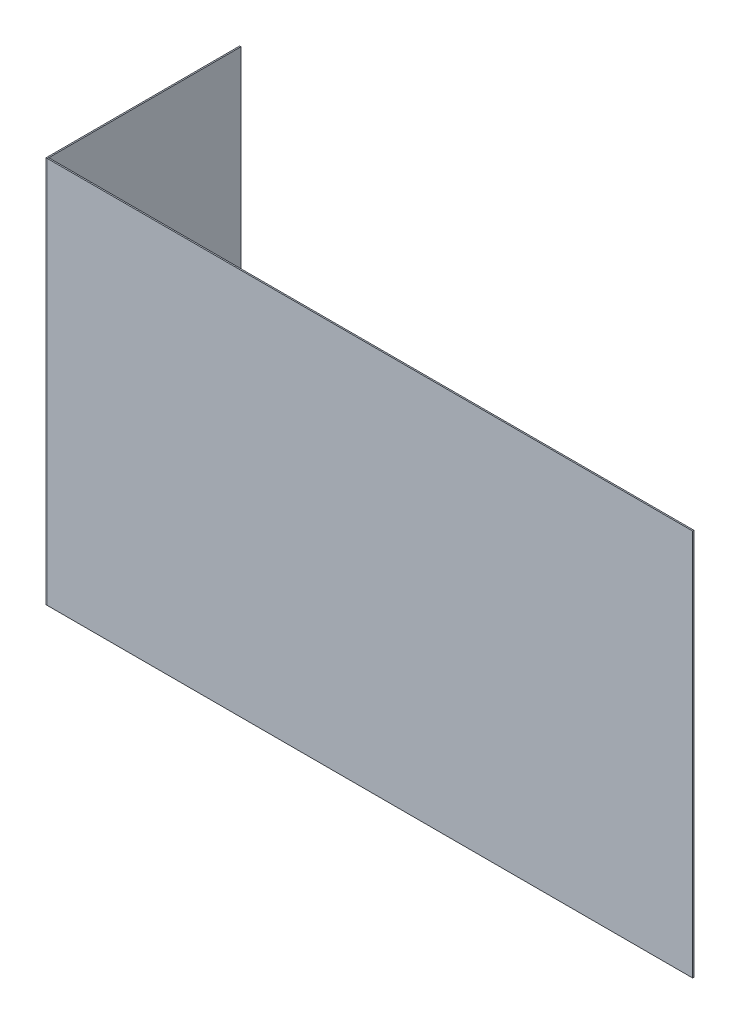
ISO-10303-21;
HEADER;
FILE_DESCRIPTION(('STEP AP214'),'2;1');
FILE_NAME('part.step','',(''),(''),'','','');
FILE_SCHEMA(('AUTOMOTIVE_DESIGN { 1 0 10303 214 1 1 1 1 }'));
ENDSEC;
DATA;
#1=APPLICATION_CONTEXT('core data for automotive mechanical design processes');
#2=APPLICATION_PROTOCOL_DEFINITION('international standard','automotive_design',2000,#1);
#3=PRODUCT_CONTEXT('',#1,'mechanical');
#4=PRODUCT('Part','Part','',(#3));
#5=PRODUCT_RELATED_PRODUCT_CATEGORY('part','',(#4));
#6=PRODUCT_DEFINITION_FORMATION('','',#4);
#7=PRODUCT_DEFINITION_CONTEXT('part definition',#1,'design');
#8=PRODUCT_DEFINITION('design','',#6,#7);
#9=PRODUCT_DEFINITION_SHAPE('','',#8);
#10=(LENGTH_UNIT() NAMED_UNIT(*) SI_UNIT(.MILLI.,.METRE.));
#11=(NAMED_UNIT(*) PLANE_ANGLE_UNIT() SI_UNIT($,.RADIAN.));
#12=(NAMED_UNIT(*) SI_UNIT($,.STERADIAN.) SOLID_ANGLE_UNIT());
#13=UNCERTAINTY_MEASURE_WITH_UNIT(LENGTH_MEASURE(1.E-05),#10,'distance_accuracy_value','');
#14=(GEOMETRIC_REPRESENTATION_CONTEXT(3) GLOBAL_UNCERTAINTY_ASSIGNED_CONTEXT((#13)) GLOBAL_UNIT_ASSIGNED_CONTEXT((#10,
#11,#12)) REPRESENTATION_CONTEXT('',''));
#15=CARTESIAN_POINT('',(0.,0.,0.));
#16=DIRECTION('',(0.,0.,1.));
#17=DIRECTION('',(1.,0.,0.));
#18=AXIS2_PLACEMENT_3D('',#15,#16,#17);
#19=CARTESIAN_POINT('',(-68.7543594667373,-13.6887447732236,2.85715075929774));
#20=DIRECTION('',(-0.999999998763547,2.53763678809025E-06,4.96635296327839E-05));
#21=DIRECTION('',(2.53763679121975E-06,0.99999999999678,0.));
#22=AXIS2_PLACEMENT_3D('',#19,#20,#21);
#23=PLANE('',#22);
#24=DIRECTION('',(-2.53763678787463E-06,-0.99999999999678,6.73555915897836E-11));
#25=VECTOR('',#24,1.);
#26=CARTESIAN_POINT('',(-68.7543594667373,-13.6887447732236,2.85715075929774));
#27=LINE('',#26,#25);
#28=CARTESIAN_POINT('',(-68.7543594667373,-13.6887447732236,2.85715075929774));
#29=VERTEX_POINT('',#28);
#30=CARTESIAN_POINT('',(-68.7543602280284,-13.9887447732226,2.85715075931795));
#31=VERTEX_POINT('',#30);
#32=EDGE_CURVE('E209',#29,#31,#27,.T.);
#33=ORIENTED_EDGE('',*,*,#32,.T.);
#34=DIRECTION('',(-4.96635296327949E-05,5.86724083053525E-11,-0.999999998766767));
#35=VECTOR('',#34,1.);
#36=CARTESIAN_POINT('',(-68.7543602280284,-13.9887447732226,2.85715075931795));
#37=LINE('',#36,#35);
#38=CARTESIAN_POINT('',(-68.7543602776919,-13.9887447732226,2.85615075931918));
#39=VERTEX_POINT('',#38);
#40=EDGE_CURVE('E21',#31,#39,#37,.T.);
#41=ORIENTED_EDGE('',*,*,#40,.T.);
#42=DIRECTION('',(-2.53763678787463E-06,-0.99999999999678,6.73555915897836E-11));
#43=VECTOR('',#42,1.);
#44=CARTESIAN_POINT('',(-68.7543595164009,-13.6887447732236,2.85615075929898));
#45=LINE('',#44,#43);
#46=CARTESIAN_POINT('',(-68.7543595164009,-13.6887447732236,2.85615075929898));
#47=VERTEX_POINT('',#46);
#48=EDGE_CURVE('E195',#47,#39,#45,.T.);
#49=ORIENTED_EDGE('',*,*,#48,.F.);
#50=DIRECTION('',(-4.96635296327949E-05,5.86724083053525E-11,-0.999999998766767));
#51=VECTOR('',#50,1.);
#52=CARTESIAN_POINT('',(-68.7543594667373,-13.6887447732236,2.85715075929774));
#53=LINE('',#52,#51);
#54=EDGE_CURVE('E11',#29,#47,#53,.T.);
#55=ORIENTED_EDGE('',*,*,#54,.F.);
#56=EDGE_LOOP('',(#33,#41,#49,#55));
#57=FACE_BOUND('',#56,.T.);
#58=ADVANCED_FACE('F17',(#57),#23,.F.);
#59=CARTESIAN_POINT('',(-69.2553594661179,-13.6887435018676,2.85717564072609));
#60=DIRECTION('',(-2.53763678787463E-06,-0.99999999999678,6.73555915897836E-11));
#61=DIRECTION('',(-0.99999999999678,2.53763678787463E-06,0.));
#62=AXIS2_PLACEMENT_3D('',#59,#60,#61);
#63=PLANE('',#62);
#64=ORIENTED_EDGE('',*,*,#54,.T.);
#65=DIRECTION('',(0.999999998763547,-2.53763678809025E-06,-4.96635296327839E-05));
#66=VECTOR('',#65,1.);
#67=CARTESIAN_POINT('',(-69.2553595157814,-13.6887435018675,2.85617564072732));
#68=LINE('',#67,#66);
#69=CARTESIAN_POINT('',(-69.2543595157826,-13.6887435044052,2.85617559106379));
#70=VERTEX_POINT('',#69);
#71=EDGE_CURVE('E74',#70,#47,#68,.T.);
#72=ORIENTED_EDGE('',*,*,#71,.F.);
#73=DIRECTION('',(-4.9663529633017E-05,5.86724083059159E-11,-0.999999998766767));
#74=VECTOR('',#73,1.);
#75=CARTESIAN_POINT('',(-69.2543594661191,-13.6887435044052,2.85717559106256));
#76=LINE('',#75,#74);
#77=CARTESIAN_POINT('',(-69.2543594661191,-13.6887435044052,2.85717559106256));
#78=VERTEX_POINT('',#77);
#79=EDGE_CURVE('E192',#78,#70,#76,.T.);
#80=ORIENTED_EDGE('',*,*,#79,.F.);
#81=DIRECTION('',(0.999999998763547,-2.53763678809025E-06,-4.96635296327839E-05));
#82=VECTOR('',#81,1.);
#83=CARTESIAN_POINT('',(-69.2553594661179,-13.6887435018676,2.85717564072609));
#84=LINE('',#83,#82);
#85=EDGE_CURVE('E204',#78,#29,#84,.T.);
#86=ORIENTED_EDGE('',*,*,#85,.T.);
#87=EDGE_LOOP('',(#64,#72,#80,#86));
#88=FACE_BOUND('',#87,.T.);
#89=ADVANCED_FACE('F19',(#88),#63,.F.);
#90=CARTESIAN_POINT('',(-68.7543602280284,-13.9887447732226,2.85715075931795));
#91=DIRECTION('',(2.53763678787463E-06,0.99999999999678,-6.73555915897837E-11));
#92=DIRECTION('',(-2.65426446715687E-05,0.,-0.999999999647744));
#93=AXIS2_PLACEMENT_3D('',#90,#91,#92);
#94=PLANE('',#93);
#95=DIRECTION('',(4.9663529633017E-05,-5.86724083059159E-11,0.999999998766767));
#96=VECTOR('',#95,1.);
#97=CARTESIAN_POINT('',(-69.2543676769396,-13.9887435043955,2.70717559126775));
#98=LINE('',#97,#96);
#99=CARTESIAN_POINT('',(-69.2543602770737,-13.9887435044042,2.856175591084));
#100=VERTEX_POINT('',#99);
#101=CARTESIAN_POINT('',(-69.2543602274101,-13.9887435044043,2.85717559108277));
#102=VERTEX_POINT('',#101);
#103=EDGE_CURVE('E189',#100,#102,#98,.T.);
#104=ORIENTED_EDGE('',*,*,#103,.F.);
#105=DIRECTION('',(-0.999999998763547,2.53763678809025E-06,4.96635296327839E-05));
#106=VECTOR('',#105,1.);
#107=CARTESIAN_POINT('',(-68.7543602776919,-13.9887447732226,2.85615075931918));
#108=LINE('',#107,#106);
#109=EDGE_CURVE('E198',#39,#100,#108,.T.);
#110=ORIENTED_EDGE('',*,*,#109,.F.);
#111=ORIENTED_EDGE('',*,*,#40,.F.);
#112=DIRECTION('',(-0.999999998763547,2.53763678809025E-06,4.96635296327839E-05));
#113=VECTOR('',#112,1.);
#114=CARTESIAN_POINT('',(-68.7543602280284,-13.9887447732226,2.85715075931795));
#115=LINE('',#114,#113);
#116=EDGE_CURVE('E84',#31,#102,#115,.T.);
#117=ORIENTED_EDGE('',*,*,#116,.T.);
#118=EDGE_LOOP('',(#104,#110,#111,#117));
#119=FACE_BOUND('',#118,.T.);
#120=ADVANCED_FACE('F216',(#119),#94,.F.);
#121=CARTESIAN_POINT('',(-69.2553594661179,-13.6887435018676,2.85717564072609));
#122=DIRECTION('',(4.96635296327949E-05,-5.86724083053525E-11,0.999999998766767));
#123=DIRECTION('',(-1.18139827634337E-06,-0.999999999999302,0.));
#124=AXIS2_PLACEMENT_3D('',#121,#122,#123);
#125=PLANE('',#124);
#126=ORIENTED_EDGE('',*,*,#85,.F.);
#127=DIRECTION('',(2.53763678787463E-06,0.99999999999678,-6.73555915897836E-11));
#128=VECTOR('',#127,1.);
#129=CARTESIAN_POINT('',(-69.2543602274101,-13.9887435044043,2.85717559108277));
#130=LINE('',#129,#128);
#131=EDGE_CURVE('E173',#102,#78,#130,.T.);
#132=ORIENTED_EDGE('',*,*,#131,.F.);
#133=ORIENTED_EDGE('',*,*,#116,.F.);
#134=ORIENTED_EDGE('',*,*,#32,.F.);
#135=EDGE_LOOP('',(#126,#132,#133,#134));
#136=FACE_BOUND('',#135,.T.);
#137=ADVANCED_FACE('F236',(#136),#125,.T.);
#138=CARTESIAN_POINT('',(-69.2553595157814,-13.6887435018675,2.85617564072732));
#139=DIRECTION('',(4.96635296327949E-05,-5.86724083053525E-11,0.999999998766767));
#140=DIRECTION('',(-1.18139827634337E-06,-0.999999999999302,0.));
#141=AXIS2_PLACEMENT_3D('',#138,#139,#140);
#142=PLANE('',#141);
#143=ORIENTED_EDGE('',*,*,#48,.T.);
#144=ORIENTED_EDGE('',*,*,#109,.T.);
#145=DIRECTION('',(2.53763678787463E-06,0.99999999999678,-6.73555915897836E-11));
#146=VECTOR('',#145,1.);
#147=CARTESIAN_POINT('',(-69.2543595157826,-13.6887435044052,2.85617559106379));
#148=LINE('',#147,#146);
#149=EDGE_CURVE('E127',#100,#70,#148,.T.);
#150=ORIENTED_EDGE('',*,*,#149,.T.);
#151=ORIENTED_EDGE('',*,*,#71,.T.);
#152=EDGE_LOOP('',(#143,#144,#150,#151));
#153=FACE_BOUND('',#152,.T.);
#154=ADVANCED_FACE('F218',(#153),#142,.F.);
#155=CARTESIAN_POINT('',(-69.2543594661191,-13.6887435044052,2.85717559106256));
#156=DIRECTION('',(-2.53763678787463E-06,-0.99999999999678,6.73555915897836E-11));
#157=DIRECTION('',(-0.99999999999678,2.53763678787463E-06,0.));
#158=AXIS2_PLACEMENT_3D('',#155,#156,#157);
#159=PLANE('',#158);
#160=DIRECTION('',(0.999999998763547,-2.53763678809025E-06,-4.96635296327839E-05));
#161=VECTOR('',#160,1.);
#162=CARTESIAN_POINT('',(-69.2553595157814,-13.6887435018675,2.85617564072732));
#163=LINE('',#162,#161);
#164=CARTESIAN_POINT('',(-69.2553595157814,-13.6887435018675,2.85617564072732));
#165=VERTEX_POINT('',#164);
#166=EDGE_CURVE('E172',#165,#70,#163,.T.);
#167=ORIENTED_EDGE('',*,*,#166,.F.);
#168=DIRECTION('',(-4.96635296327949E-05,5.86724083053525E-11,-0.999999998766767));
#169=VECTOR('',#168,1.);
#170=CARTESIAN_POINT('',(-69.2553594661179,-13.6887435018676,2.85717564072609));
#171=LINE('',#170,#169);
#172=CARTESIAN_POINT('',(-69.2553594661179,-13.6887435018676,2.85717564072609));
#173=VERTEX_POINT('',#172);
#174=EDGE_CURVE('E160',#173,#165,#171,.T.);
#175=ORIENTED_EDGE('',*,*,#174,.F.);
#176=DIRECTION('',(-0.999999998763547,2.53763678809025E-06,4.96635296327839E-05));
#177=VECTOR('',#176,1.);
#178=CARTESIAN_POINT('',(-69.2543594661191,-13.6887435044052,2.85717559106256));
#179=LINE('',#178,#177);
#180=EDGE_CURVE('E177',#78,#173,#179,.T.);
#181=ORIENTED_EDGE('',*,*,#180,.F.);
#182=ORIENTED_EDGE('',*,*,#79,.T.);
#183=EDGE_LOOP('',(#167,#175,#181,#182));
#184=FACE_BOUND('',#183,.T.);
#185=ADVANCED_FACE('F224',(#184),#159,.F.);
#186=CARTESIAN_POINT('',(-69.2543676769396,-13.9887435043955,2.70717559126775));
#187=DIRECTION('',(2.53763678787463E-06,0.99999999999678,-6.73555915897837E-11));
#188=DIRECTION('',(-2.65426446715687E-05,0.,-0.999999999647744));
#189=AXIS2_PLACEMENT_3D('',#186,#187,#188);
#190=PLANE('',#189);
#191=DIRECTION('',(-0.999999998763547,2.53763678809025E-06,4.96635296327839E-05));
#192=VECTOR('',#191,1.);
#193=CARTESIAN_POINT('',(-69.2543602274101,-13.9887435044043,2.85717559108277));
#194=LINE('',#193,#192);
#195=CARTESIAN_POINT('',(-69.2553602274089,-13.9887435018666,2.8571756407463));
#196=VERTEX_POINT('',#195);
#197=EDGE_CURVE('E186',#102,#196,#194,.T.);
#198=ORIENTED_EDGE('',*,*,#197,.T.);
#199=DIRECTION('',(-4.96635296327949E-05,5.86724083053525E-11,-0.999999998766767));
#200=VECTOR('',#199,1.);
#201=CARTESIAN_POINT('',(-69.2553602274089,-13.9887435018666,2.8571756407463));
#202=LINE('',#201,#200);
#203=CARTESIAN_POINT('',(-69.2553602770724,-13.9887435018666,2.85617564074753));
#204=VERTEX_POINT('',#203);
#205=EDGE_CURVE('E164',#196,#204,#202,.T.);
#206=ORIENTED_EDGE('',*,*,#205,.T.);
#207=DIRECTION('',(-0.999999998763547,2.53763678809025E-06,4.96635296327839E-05));
#208=VECTOR('',#207,1.);
#209=CARTESIAN_POINT('',(-68.7543602776919,-13.9887447732226,2.85615075931918));
#210=LINE('',#209,#208);
#211=EDGE_CURVE('E133',#100,#204,#210,.T.);
#212=ORIENTED_EDGE('',*,*,#211,.F.);
#213=ORIENTED_EDGE('',*,*,#103,.T.);
#214=EDGE_LOOP('',(#198,#206,#212,#213));
#215=FACE_BOUND('',#214,.T.);
#216=ADVANCED_FACE('F252',(#215),#190,.F.);
#217=CARTESIAN_POINT('',(-69.2553594661179,-13.6887435018676,2.85717564072609));
#218=DIRECTION('',(4.96635296327949E-05,-5.86724083053525E-11,0.999999998766767));
#219=DIRECTION('',(-1.18139827634337E-06,-0.999999999999302,0.));
#220=AXIS2_PLACEMENT_3D('',#217,#218,#219);
#221=PLANE('',#220);
#222=ORIENTED_EDGE('',*,*,#131,.T.);
#223=ORIENTED_EDGE('',*,*,#180,.T.);
#224=DIRECTION('',(2.53763678787463E-06,0.99999999999678,-6.73555915897836E-11));
#225=VECTOR('',#224,1.);
#226=CARTESIAN_POINT('',(-69.2553602274089,-13.9887435018666,2.8571756407463));
#227=LINE('',#226,#225);
#228=EDGE_CURVE('E132',#196,#173,#227,.T.);
#229=ORIENTED_EDGE('',*,*,#228,.F.);
#230=ORIENTED_EDGE('',*,*,#197,.F.);
#231=EDGE_LOOP('',(#222,#223,#229,#230));
#232=FACE_BOUND('',#231,.T.);
#233=ADVANCED_FACE('F233',(#232),#221,.T.);
#234=CARTESIAN_POINT('',(-69.2543594661191,-13.6887435044052,2.85717559106256));
#235=DIRECTION('',(0.999999998763547,-2.53763678809025E-06,-4.9663529633006E-05));
#236=DIRECTION('',(0.,-0.998697120149495,0.0510300127876302));
#237=AXIS2_PLACEMENT_3D('',#234,#235,#236);
#238=PLANE('',#237);
#239=DIRECTION('',(-4.9663529633017E-05,5.86724083059159E-11,-0.999999998766767));
#240=VECTOR('',#239,1.);
#241=CARTESIAN_POINT('',(-69.2543594661191,-13.6887435044052,2.85717559106256));
#242=LINE('',#241,#240);
#243=CARTESIAN_POINT('',(-69.2543669156486,-13.6887435043964,2.70717559124754));
#244=VERTEX_POINT('',#243);
#245=EDGE_CURVE('E113',#70,#244,#242,.T.);
#246=ORIENTED_EDGE('',*,*,#245,.F.);
#247=ORIENTED_EDGE('',*,*,#149,.F.);
#248=DIRECTION('',(4.9663529633017E-05,-5.86724083059159E-11,0.999999998766767));
#249=VECTOR('',#248,1.);
#250=CARTESIAN_POINT('',(-69.2543676769396,-13.9887435043955,2.70717559126775));
#251=LINE('',#250,#249);
#252=CARTESIAN_POINT('',(-69.2543676769396,-13.9887435043955,2.70717559126775));
#253=VERTEX_POINT('',#252);
#254=EDGE_CURVE('E121',#253,#100,#251,.T.);
#255=ORIENTED_EDGE('',*,*,#254,.F.);
#256=DIRECTION('',(-2.53763678787463E-06,-0.99999999999678,6.73555915897836E-11));
#257=VECTOR('',#256,1.);
#258=CARTESIAN_POINT('',(-69.2543669156486,-13.6887435043964,2.70717559124754));
#259=LINE('',#258,#257);
#260=EDGE_CURVE('E125',#244,#253,#259,.T.);
#261=ORIENTED_EDGE('',*,*,#260,.F.);
#262=EDGE_LOOP('',(#246,#247,#255,#261));
#263=FACE_BOUND('',#262,.T.);
#264=ADVANCED_FACE('F123',(#263),#238,.T.);
#265=CARTESIAN_POINT('',(-69.2543594661191,-13.6887435044052,2.85717559106256));
#266=DIRECTION('',(-2.53763678787463E-06,-0.99999999999678,6.73555915897836E-11));
#267=DIRECTION('',(-0.99999999999678,2.53763678787463E-06,0.));
#268=AXIS2_PLACEMENT_3D('',#265,#266,#267);
#269=PLANE('',#268);
#270=DIRECTION('',(-0.999999998763547,2.53763678809025E-06,4.96635296327839E-05));
#271=VECTOR('',#270,1.);
#272=CARTESIAN_POINT('',(-69.2543669156486,-13.6887435043964,2.70717559124754));
#273=LINE('',#272,#271);
#274=CARTESIAN_POINT('',(-69.2553669156473,-13.6887435018588,2.70717564091107));
#275=VERTEX_POINT('',#274);
#276=EDGE_CURVE('E144',#244,#275,#273,.T.);
#277=ORIENTED_EDGE('',*,*,#276,.T.);
#278=DIRECTION('',(-4.9663529633017E-05,5.86724083059159E-11,-0.999999998766767));
#279=VECTOR('',#278,1.);
#280=CARTESIAN_POINT('',(-69.2553594661179,-13.6887435018676,2.85717564072609));
#281=LINE('',#280,#279);
#282=EDGE_CURVE('E148',#165,#275,#281,.T.);
#283=ORIENTED_EDGE('',*,*,#282,.F.);
#284=ORIENTED_EDGE('',*,*,#166,.T.);
#285=ORIENTED_EDGE('',*,*,#245,.T.);
#286=EDGE_LOOP('',(#277,#283,#284,#285));
#287=FACE_BOUND('',#286,.T.);
#288=ADVANCED_FACE('F220',(#287),#269,.F.);
#289=CARTESIAN_POINT('',(-69.2553602274089,-13.9887435018666,2.8571756407463));
#290=DIRECTION('',(0.999999998763547,-2.53763678809025E-06,-4.96635296327839E-05));
#291=DIRECTION('',(0.,-0.998697120149483,0.0510300127878578));
#292=AXIS2_PLACEMENT_3D('',#289,#290,#291);
#293=PLANE('',#292);
#294=ORIENTED_EDGE('',*,*,#228,.T.);
#295=ORIENTED_EDGE('',*,*,#174,.T.);
#296=DIRECTION('',(2.53763678787463E-06,0.99999999999678,-6.73555915897836E-11));
#297=VECTOR('',#296,1.);
#298=CARTESIAN_POINT('',(-69.2553602770724,-13.9887435018666,2.85617564074753));
#299=LINE('',#298,#297);
#300=EDGE_CURVE('E155',#204,#165,#299,.T.);
#301=ORIENTED_EDGE('',*,*,#300,.F.);
#302=ORIENTED_EDGE('',*,*,#205,.F.);
#303=EDGE_LOOP('',(#294,#295,#301,#302));
#304=FACE_BOUND('',#303,.T.);
#305=ADVANCED_FACE('F228',(#304),#293,.F.);
#306=CARTESIAN_POINT('',(-69.2543676769396,-13.9887435043955,2.70717559126775));
#307=DIRECTION('',(2.53763678787463E-06,0.99999999999678,-6.73555915897837E-11));
#308=DIRECTION('',(-2.65426446715687E-05,0.,-0.999999999647744));
#309=AXIS2_PLACEMENT_3D('',#306,#307,#308);
#310=PLANE('',#309);
#311=ORIENTED_EDGE('',*,*,#211,.T.);
#312=DIRECTION('',(4.9663529633017E-05,-5.86724083059159E-11,0.999999998766767));
#313=VECTOR('',#312,1.);
#314=CARTESIAN_POINT('',(-69.2553676769383,-13.9887435018578,2.70717564093128));
#315=LINE('',#314,#313);
#316=CARTESIAN_POINT('',(-69.2553676769383,-13.9887435018578,2.70717564093128));
#317=VERTEX_POINT('',#316);
#318=EDGE_CURVE('E139',#317,#204,#315,.T.);
#319=ORIENTED_EDGE('',*,*,#318,.F.);
#320=DIRECTION('',(-0.999999998763547,2.53763678809025E-06,4.96635296327839E-05));
#321=VECTOR('',#320,1.);
#322=CARTESIAN_POINT('',(-69.2543676769396,-13.9887435043955,2.70717559126775));
#323=LINE('',#322,#321);
#324=EDGE_CURVE('E136',#253,#317,#323,.T.);
#325=ORIENTED_EDGE('',*,*,#324,.F.);
#326=ORIENTED_EDGE('',*,*,#254,.T.);
#327=EDGE_LOOP('',(#311,#319,#325,#326));
#328=FACE_BOUND('',#327,.T.);
#329=ADVANCED_FACE('F137',(#328),#310,.F.);
#330=CARTESIAN_POINT('',(-69.2543669156486,-13.6887435043964,2.70717559124754));
#331=DIRECTION('',(4.96635296327949E-05,-5.86724083053525E-11,0.999999998766767));
#332=DIRECTION('',(-1.18139827634337E-06,-0.999999999999302,0.));
#333=AXIS2_PLACEMENT_3D('',#330,#331,#332);
#334=PLANE('',#333);
#335=ORIENTED_EDGE('',*,*,#260,.T.);
#336=ORIENTED_EDGE('',*,*,#324,.T.);
#337=DIRECTION('',(-2.53763678787463E-06,-0.99999999999678,6.73555915897836E-11));
#338=VECTOR('',#337,1.);
#339=CARTESIAN_POINT('',(-69.2553669156473,-13.6887435018588,2.70717564091107));
#340=LINE('',#339,#338);
#341=EDGE_CURVE('E463',#275,#317,#340,.T.);
#342=ORIENTED_EDGE('',*,*,#341,.F.);
#343=ORIENTED_EDGE('',*,*,#276,.F.);
#344=EDGE_LOOP('',(#335,#336,#342,#343));
#345=FACE_BOUND('',#344,.T.);
#346=ADVANCED_FACE('F146',(#345),#334,.F.);
#347=CARTESIAN_POINT('',(-69.2553594661179,-13.6887435018676,2.85717564072609));
#348=DIRECTION('',(0.999999998763547,-2.53763678809025E-06,-4.9663529633006E-05));
#349=DIRECTION('',(0.,-0.998697120149495,0.0510300127876302));
#350=AXIS2_PLACEMENT_3D('',#347,#348,#349);
#351=PLANE('',#350);
#352=ORIENTED_EDGE('',*,*,#341,.T.);
#353=ORIENTED_EDGE('',*,*,#318,.T.);
#354=ORIENTED_EDGE('',*,*,#300,.T.);
#355=ORIENTED_EDGE('',*,*,#282,.T.);
#356=EDGE_LOOP('',(#352,#353,#354,#355));
#357=FACE_BOUND('',#356,.T.);
#358=ADVANCED_FACE('F253',(#357),#351,.F.);
#359=CLOSED_SHELL('',(#58,#89,#120,#137,#154,#185,#216,#233,#264,#288,#305,#329,#346,#358));
#360=MANIFOLD_SOLID_BREP('B1',#359);
#361=ADVANCED_BREP_SHAPE_REPRESENTATION('',(#18,#360),#14);
#362=SHAPE_DEFINITION_REPRESENTATION(#9,#361);
ENDSEC;
END-ISO-10303-21;
